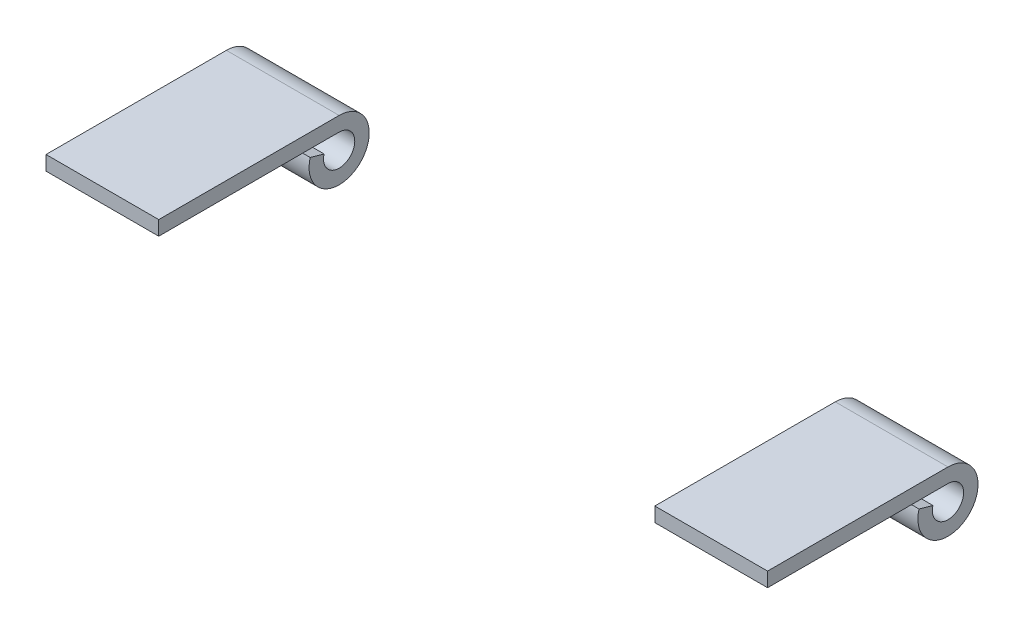
ISO-10303-21;
HEADER;
FILE_DESCRIPTION(('STEP AP214'),'2;1');
FILE_NAME('part.step','',(''),(''),'','','');
FILE_SCHEMA(('AUTOMOTIVE_DESIGN { 1 0 10303 214 1 1 1 1 }'));
ENDSEC;
DATA;
#1=APPLICATION_CONTEXT('core data for automotive mechanical design processes');
#2=APPLICATION_PROTOCOL_DEFINITION('international standard','automotive_design',2000,#1);
#3=PRODUCT_CONTEXT('',#1,'mechanical');
#4=PRODUCT('Part','Part','',(#3));
#5=PRODUCT_RELATED_PRODUCT_CATEGORY('part','',(#4));
#6=PRODUCT_DEFINITION_FORMATION('','',#4);
#7=PRODUCT_DEFINITION_CONTEXT('part definition',#1,'design');
#8=PRODUCT_DEFINITION('design','',#6,#7);
#9=PRODUCT_DEFINITION_SHAPE('','',#8);
#10=(LENGTH_UNIT() NAMED_UNIT(*) SI_UNIT(.MILLI.,.METRE.));
#11=(NAMED_UNIT(*) PLANE_ANGLE_UNIT() SI_UNIT($,.RADIAN.));
#12=(NAMED_UNIT(*) SI_UNIT($,.STERADIAN.) SOLID_ANGLE_UNIT());
#13=UNCERTAINTY_MEASURE_WITH_UNIT(LENGTH_MEASURE(1.E-05),#10,'distance_accuracy_value','');
#14=(GEOMETRIC_REPRESENTATION_CONTEXT(3) GLOBAL_UNCERTAINTY_ASSIGNED_CONTEXT((#13)) GLOBAL_UNIT_ASSIGNED_CONTEXT((#10,
#11,#12)) REPRESENTATION_CONTEXT('',''));
#15=CARTESIAN_POINT('',(0.,0.,0.));
#16=DIRECTION('',(0.,0.,1.));
#17=DIRECTION('',(1.,0.,0.));
#18=AXIS2_PLACEMENT_3D('',#15,#16,#17);
#19=CARTESIAN_POINT('',(-9.14260440613743,-31.4959999999984,0.));
#20=DIRECTION('',(0.,1.,0.));
#21=DIRECTION('',(0.,0.,1.));
#22=AXIS2_PLACEMENT_3D('',#19,#20,#21);
#23=PLANE('',#22);
#24=DIRECTION('',(0.,0.,-1.));
#25=VECTOR('',#24,1.);
#26=CARTESIAN_POINT('',(-104.775,-31.4959999999984,0.));
#27=LINE('',#26,#25);
#28=CARTESIAN_POINT('',(-104.775,-31.4959999999999,-1464.58633761999));
#29=VERTEX_POINT('',#28);
#30=CARTESIAN_POINT('',(-104.775,-31.4959999999999,-1540.78633761999));
#31=VERTEX_POINT('',#30);
#32=EDGE_CURVE('E129',#29,#31,#27,.T.);
#33=ORIENTED_EDGE('',*,*,#32,.F.);
#34=DIRECTION('',(-1.,0.,0.));
#35=VECTOR('',#34,1.);
#36=CARTESIAN_POINT('',(-9.14260440613743,-31.4959999999999,-1464.58633761999));
#37=LINE('',#36,#35);
#38=CARTESIAN_POINT('',(-152.4,-31.4959999999999,-1464.58633761999));
#39=VERTEX_POINT('',#38);
#40=EDGE_CURVE('E50',#29,#39,#37,.T.);
#41=ORIENTED_EDGE('',*,*,#40,.T.);
#42=DIRECTION('',(0.,0.,-1.));
#43=VECTOR('',#42,1.);
#44=CARTESIAN_POINT('',(-152.4,-31.4959999999984,0.));
#45=LINE('',#44,#43);
#46=CARTESIAN_POINT('',(-152.4,-31.4959999999999,-1540.78633761999));
#47=VERTEX_POINT('',#46);
#48=EDGE_CURVE('E135',#39,#47,#45,.T.);
#49=ORIENTED_EDGE('',*,*,#48,.T.);
#50=DIRECTION('',(-1.,0.,0.));
#51=VECTOR('',#50,1.);
#52=CARTESIAN_POINT('',(-9.14260440613743,-31.4959999999999,-1540.78633761999));
#53=LINE('',#52,#51);
#54=EDGE_CURVE('E94',#31,#47,#53,.T.);
#55=ORIENTED_EDGE('',*,*,#54,.F.);
#56=EDGE_LOOP('',(#33,#41,#49,#55));
#57=FACE_BOUND('',#56,.T.);
#58=ADVANCED_FACE('F46',(#57),#23,.F.);
#59=CARTESIAN_POINT('',(-9.14260440613743,-38.1000000000001,-1540.78633761999));
#60=DIRECTION('',(-1.,0.,0.));
#61=DIRECTION('',(0.,0.,1.));
#62=AXIS2_PLACEMENT_3D('',#59,#60,#61);
#63=CYLINDRICAL_SURFACE('',#62,6.60400000000012);
#64=DIRECTION('',(-1.,0.,0.));
#65=VECTOR('',#64,1.);
#66=CARTESIAN_POINT('',(-9.14260440613743,-36.3169200000001,-1534.42760805241));
#67=LINE('',#66,#65);
#68=CARTESIAN_POINT('',(-104.775,-36.3169200000001,-1534.42760805241));
#69=VERTEX_POINT('',#68);
#70=CARTESIAN_POINT('',(-152.4,-36.3169200000001,-1534.42760805241));
#71=VERTEX_POINT('',#70);
#72=EDGE_CURVE('E144',#69,#71,#67,.T.);
#73=ORIENTED_EDGE('',*,*,#72,.F.);
#74=CARTESIAN_POINT('',(-104.775,-38.1000000000001,-1540.78633761999));
#75=DIRECTION('',(1.,0.,0.));
#76=DIRECTION('',(0.,0.,-1.));
#77=AXIS2_PLACEMENT_3D('',#74,#75,#76);
#78=CIRCLE('',#77,6.60400000000012);
#79=EDGE_CURVE('E101',#69,#31,#78,.T.);
#80=ORIENTED_EDGE('',*,*,#79,.T.);
#81=ORIENTED_EDGE('',*,*,#54,.T.);
#82=CARTESIAN_POINT('',(-152.4,-38.1000000000001,-1540.78633761999));
#83=DIRECTION('',(1.,0.,0.));
#84=DIRECTION('',(0.,0.,-1.));
#85=AXIS2_PLACEMENT_3D('',#82,#83,#84);
#86=CIRCLE('',#85,6.60400000000012);
#87=EDGE_CURVE('E141',#71,#47,#86,.T.);
#88=ORIENTED_EDGE('',*,*,#87,.F.);
#89=EDGE_LOOP('',(#73,#80,#81,#88));
#90=FACE_BOUND('',#89,.T.);
#91=ADVANCED_FACE('F172',(#90),#63,.F.);
#92=CARTESIAN_POINT('',(-9.14260440613743,365.239237945725,-102.418379878407));
#93=DIRECTION('',(0.,-0.962860322165154,0.270000000000029));
#94=DIRECTION('',(0.,-0.270000000000029,-0.962860322165154));
#95=AXIS2_PLACEMENT_3D('',#92,#93,#94);
#96=PLANE('',#95);
#97=DIRECTION('',(0.,0.270000000000029,0.962860322165154));
#98=VECTOR('',#97,1.);
#99=CARTESIAN_POINT('',(-104.775,365.239237945725,-102.418379878407));
#100=LINE('',#99,#98);
#101=CARTESIAN_POINT('',(-104.775,-34.6709999999999,-1528.55801152849));
#102=VERTEX_POINT('',#101);
#103=EDGE_CURVE('E123',#69,#102,#100,.T.);
#104=ORIENTED_EDGE('',*,*,#103,.F.);
#105=ORIENTED_EDGE('',*,*,#72,.T.);
#106=DIRECTION('',(0.,0.270000000000029,0.962860322165154));
#107=VECTOR('',#106,1.);
#108=CARTESIAN_POINT('',(-152.4,365.239237945725,-102.418379878407));
#109=LINE('',#108,#107);
#110=CARTESIAN_POINT('',(-152.4,-34.6709999999999,-1528.55801152849));
#111=VERTEX_POINT('',#110);
#112=EDGE_CURVE('E147',#71,#111,#109,.T.);
#113=ORIENTED_EDGE('',*,*,#112,.T.);
#114=DIRECTION('',(-1.,0.,0.));
#115=VECTOR('',#114,1.);
#116=CARTESIAN_POINT('',(-9.14260440613743,-34.6709999999999,-1528.55801152849));
#117=LINE('',#116,#115);
#118=EDGE_CURVE('E148',#102,#111,#117,.T.);
#119=ORIENTED_EDGE('',*,*,#118,.F.);
#120=EDGE_LOOP('',(#104,#105,#113,#119));
#121=FACE_BOUND('',#120,.T.);
#122=ADVANCED_FACE('F174',(#121),#96,.F.);
#123=CARTESIAN_POINT('',(-9.14260440613743,-38.1000000000001,-1540.78633761999));
#124=DIRECTION('',(-1.,0.,0.));
#125=DIRECTION('',(0.,0.,1.));
#126=AXIS2_PLACEMENT_3D('',#123,#124,#125);
#127=CYLINDRICAL_SURFACE('',#126,12.7);
#128=CARTESIAN_POINT('',(-104.775,-38.1000000000001,-1540.78633761999));
#129=DIRECTION('',(1.,0.,0.));
#130=DIRECTION('',(0.,0.,-1.));
#131=AXIS2_PLACEMENT_3D('',#128,#129,#130);
#132=CIRCLE('',#131,12.7);
#133=CARTESIAN_POINT('',(-104.775,-25.4000000000001,-1540.78633761999));
#134=VERTEX_POINT('',#133);
#135=EDGE_CURVE('E56',#102,#134,#132,.T.);
#136=ORIENTED_EDGE('',*,*,#135,.F.);
#137=ORIENTED_EDGE('',*,*,#118,.T.);
#138=CARTESIAN_POINT('',(-152.4,-38.1000000000001,-1540.78633761999));
#139=DIRECTION('',(1.,0.,0.));
#140=DIRECTION('',(0.,0.,-1.));
#141=AXIS2_PLACEMENT_3D('',#138,#139,#140);
#142=CIRCLE('',#141,12.7);
#143=CARTESIAN_POINT('',(-152.4,-25.4000000000001,-1540.78633761999));
#144=VERTEX_POINT('',#143);
#145=EDGE_CURVE('E117',#111,#144,#142,.T.);
#146=ORIENTED_EDGE('',*,*,#145,.T.);
#147=DIRECTION('',(-1.,0.,0.));
#148=VECTOR('',#147,1.);
#149=CARTESIAN_POINT('',(-9.14260440613743,-25.4000000000001,-1540.78633761999));
#150=LINE('',#149,#148);
#151=EDGE_CURVE('E108',#134,#144,#150,.T.);
#152=ORIENTED_EDGE('',*,*,#151,.F.);
#153=EDGE_LOOP('',(#136,#137,#146,#152));
#154=FACE_BOUND('',#153,.T.);
#155=ADVANCED_FACE('F114',(#154),#127,.T.);
#156=CARTESIAN_POINT('',(-9.14260440613743,-25.3999999999992,0.));
#157=DIRECTION('',(0.,-1.,0.));
#158=DIRECTION('',(0.,0.,-1.));
#159=AXIS2_PLACEMENT_3D('',#156,#157,#158);
#160=PLANE('',#159);
#161=DIRECTION('',(0.,0.,1.));
#162=VECTOR('',#161,1.);
#163=CARTESIAN_POINT('',(-104.775,-25.3999999999992,0.));
#164=LINE('',#163,#162);
#165=CARTESIAN_POINT('',(-104.775,-25.4,-1464.58633761999));
#166=VERTEX_POINT('',#165);
#167=EDGE_CURVE('E12',#134,#166,#164,.T.);
#168=ORIENTED_EDGE('',*,*,#167,.F.);
#169=ORIENTED_EDGE('',*,*,#151,.T.);
#170=DIRECTION('',(0.,0.,1.));
#171=VECTOR('',#170,1.);
#172=CARTESIAN_POINT('',(-152.4,-25.3999999999992,0.));
#173=LINE('',#172,#171);
#174=CARTESIAN_POINT('',(-152.4,-25.4,-1464.58633761999));
#175=VERTEX_POINT('',#174);
#176=EDGE_CURVE('E120',#144,#175,#173,.T.);
#177=ORIENTED_EDGE('',*,*,#176,.T.);
#178=DIRECTION('',(-1.,0.,0.));
#179=VECTOR('',#178,1.);
#180=CARTESIAN_POINT('',(-9.14260440613743,-25.4,-1464.58633761999));
#181=LINE('',#180,#179);
#182=EDGE_CURVE('E69',#166,#175,#181,.T.);
#183=ORIENTED_EDGE('',*,*,#182,.F.);
#184=EDGE_LOOP('',(#168,#169,#177,#183));
#185=FACE_BOUND('',#184,.T.);
#186=ADVANCED_FACE('F107',(#185),#160,.F.);
#187=CARTESIAN_POINT('',(-9.14260440613743,0.,-1464.58633761999));
#188=DIRECTION('',(0.,0.,-1.));
#189=DIRECTION('',(-1.,0.,0.));
#190=AXIS2_PLACEMENT_3D('',#187,#188,#189);
#191=PLANE('',#190);
#192=DIRECTION('',(0.,-1.,0.));
#193=VECTOR('',#192,1.);
#194=CARTESIAN_POINT('',(-104.775,0.,-1464.58633761999));
#195=LINE('',#194,#193);
#196=EDGE_CURVE('E139',#166,#29,#195,.T.);
#197=ORIENTED_EDGE('',*,*,#196,.F.);
#198=ORIENTED_EDGE('',*,*,#182,.T.);
#199=DIRECTION('',(0.,-1.,0.));
#200=VECTOR('',#199,1.);
#201=CARTESIAN_POINT('',(-152.4,0.,-1464.58633761999));
#202=LINE('',#201,#200);
#203=EDGE_CURVE('E151',#175,#39,#202,.T.);
#204=ORIENTED_EDGE('',*,*,#203,.T.);
#205=ORIENTED_EDGE('',*,*,#40,.F.);
#206=EDGE_LOOP('',(#197,#198,#204,#205));
#207=FACE_BOUND('',#206,.T.);
#208=ADVANCED_FACE('F168',(#207),#191,.F.);
#209=CARTESIAN_POINT('',(-152.4,-38.1000000000001,-1540.78633761999));
#210=DIRECTION('',(1.,0.,0.));
#211=DIRECTION('',(0.,0.,-1.));
#212=AXIS2_PLACEMENT_3D('',#209,#210,#211);
#213=PLANE('',#212);
#214=ORIENTED_EDGE('',*,*,#48,.F.);
#215=ORIENTED_EDGE('',*,*,#203,.F.);
#216=ORIENTED_EDGE('',*,*,#176,.F.);
#217=ORIENTED_EDGE('',*,*,#145,.F.);
#218=ORIENTED_EDGE('',*,*,#112,.F.);
#219=ORIENTED_EDGE('',*,*,#87,.T.);
#220=EDGE_LOOP('',(#214,#215,#216,#217,#218,#219));
#221=FACE_BOUND('',#220,.T.);
#222=ADVANCED_FACE('F170',(#221),#213,.F.);
#223=CARTESIAN_POINT('',(-104.775,-38.1000000000001,-1540.78633761999));
#224=DIRECTION('',(1.,0.,0.));
#225=DIRECTION('',(0.,0.,-1.));
#226=AXIS2_PLACEMENT_3D('',#223,#224,#225);
#227=PLANE('',#226);
#228=ORIENTED_EDGE('',*,*,#196,.T.);
#229=ORIENTED_EDGE('',*,*,#32,.T.);
#230=ORIENTED_EDGE('',*,*,#79,.F.);
#231=ORIENTED_EDGE('',*,*,#103,.T.);
#232=ORIENTED_EDGE('',*,*,#135,.T.);
#233=ORIENTED_EDGE('',*,*,#167,.T.);
#234=EDGE_LOOP('',(#228,#229,#230,#231,#232,#233));
#235=FACE_BOUND('',#234,.T.);
#236=ADVANCED_FACE('F48',(#235),#227,.T.);
#237=CLOSED_SHELL('',(#58,#91,#122,#155,#186,#208,#222,#236));
#238=MANIFOLD_SOLID_BREP('B2',#237);
#239=CARTESIAN_POINT('',(9.14260440613743,-25.3999999999992,0.));
#240=DIRECTION('',(0.,-1.,0.));
#241=DIRECTION('',(0.,0.,-1.));
#242=AXIS2_PLACEMENT_3D('',#239,#240,#241);
#243=PLANE('',#242);
#244=DIRECTION('',(0.,0.,-1.));
#245=VECTOR('',#244,1.);
#246=CARTESIAN_POINT('',(104.775,-25.3999999999992,0.));
#247=LINE('',#246,#245);
#248=CARTESIAN_POINT('',(104.775,-25.4,-1464.58633761999));
#249=VERTEX_POINT('',#248);
#250=CARTESIAN_POINT('',(104.775,-25.4000000000001,-1540.78633761999));
#251=VERTEX_POINT('',#250);
#252=EDGE_CURVE('E330',#249,#251,#247,.T.);
#253=ORIENTED_EDGE('',*,*,#252,.F.);
#254=DIRECTION('',(1.,0.,0.));
#255=VECTOR('',#254,1.);
#256=CARTESIAN_POINT('',(9.14260440613743,-25.4,-1464.58633761999));
#257=LINE('',#256,#255);
#258=CARTESIAN_POINT('',(152.4,-25.4,-1464.58633761999));
#259=VERTEX_POINT('',#258);
#260=EDGE_CURVE('E251',#249,#259,#257,.T.);
#261=ORIENTED_EDGE('',*,*,#260,.T.);
#262=DIRECTION('',(0.,0.,-1.));
#263=VECTOR('',#262,1.);
#264=CARTESIAN_POINT('',(152.4,-25.3999999999992,0.));
#265=LINE('',#264,#263);
#266=CARTESIAN_POINT('',(152.4,-25.4000000000001,-1540.78633761999));
#267=VERTEX_POINT('',#266);
#268=EDGE_CURVE('E336',#259,#267,#265,.T.);
#269=ORIENTED_EDGE('',*,*,#268,.T.);
#270=DIRECTION('',(1.,0.,0.));
#271=VECTOR('',#270,1.);
#272=CARTESIAN_POINT('',(9.14260440613743,-25.4000000000001,-1540.78633761999));
#273=LINE('',#272,#271);
#274=EDGE_CURVE('E295',#251,#267,#273,.T.);
#275=ORIENTED_EDGE('',*,*,#274,.F.);
#276=EDGE_LOOP('',(#253,#261,#269,#275));
#277=FACE_BOUND('',#276,.T.);
#278=ADVANCED_FACE('F247',(#277),#243,.F.);
#279=CARTESIAN_POINT('',(9.14260440613743,-38.1000000000001,-1540.78633761999));
#280=DIRECTION('',(1.,0.,0.));
#281=DIRECTION('',(0.,0.,-1.));
#282=AXIS2_PLACEMENT_3D('',#279,#280,#281);
#283=CYLINDRICAL_SURFACE('',#282,12.7);
#284=DIRECTION('',(1.,0.,0.));
#285=VECTOR('',#284,1.);
#286=CARTESIAN_POINT('',(9.14260440613743,-34.671,-1528.55801152849));
#287=LINE('',#286,#285);
#288=CARTESIAN_POINT('',(104.775,-34.671,-1528.55801152849));
#289=VERTEX_POINT('',#288);
#290=CARTESIAN_POINT('',(152.4,-34.671,-1528.55801152849));
#291=VERTEX_POINT('',#290);
#292=EDGE_CURVE('E345',#289,#291,#287,.T.);
#293=ORIENTED_EDGE('',*,*,#292,.F.);
#294=CARTESIAN_POINT('',(104.775,-38.1000000000001,-1540.78633761999));
#295=DIRECTION('',(-1.,0.,0.));
#296=DIRECTION('',(0.,0.,1.));
#297=AXIS2_PLACEMENT_3D('',#294,#295,#296);
#298=CIRCLE('',#297,12.7);
#299=EDGE_CURVE('E302',#289,#251,#298,.F.);
#300=ORIENTED_EDGE('',*,*,#299,.T.);
#301=ORIENTED_EDGE('',*,*,#274,.T.);
#302=CARTESIAN_POINT('',(152.4,-38.1000000000001,-1540.78633761999));
#303=DIRECTION('',(1.,0.,0.));
#304=DIRECTION('',(0.,0.,-1.));
#305=AXIS2_PLACEMENT_3D('',#302,#303,#304);
#306=CIRCLE('',#305,12.7);
#307=EDGE_CURVE('E342',#291,#267,#306,.T.);
#308=ORIENTED_EDGE('',*,*,#307,.F.);
#309=EDGE_LOOP('',(#293,#300,#301,#308));
#310=FACE_BOUND('',#309,.T.);
#311=ADVANCED_FACE('F373',(#310),#283,.T.);
#312=CARTESIAN_POINT('',(9.14260440613743,365.239237945725,-102.418379878407));
#313=DIRECTION('',(0.,-0.962860322165154,0.270000000000029));
#314=DIRECTION('',(0.,-0.270000000000029,-0.962860322165154));
#315=AXIS2_PLACEMENT_3D('',#312,#313,#314);
#316=PLANE('',#315);
#317=DIRECTION('',(0.,-0.270000000000029,-0.962860322165154));
#318=VECTOR('',#317,1.);
#319=CARTESIAN_POINT('',(104.775,365.239237945725,-102.418379878407));
#320=LINE('',#319,#318);
#321=CARTESIAN_POINT('',(104.775,-36.3169200000001,-1534.42760805241));
#322=VERTEX_POINT('',#321);
#323=EDGE_CURVE('E324',#289,#322,#320,.T.);
#324=ORIENTED_EDGE('',*,*,#323,.F.);
#325=ORIENTED_EDGE('',*,*,#292,.T.);
#326=DIRECTION('',(0.,-0.270000000000029,-0.962860322165154));
#327=VECTOR('',#326,1.);
#328=CARTESIAN_POINT('',(152.4,365.239237945725,-102.418379878407));
#329=LINE('',#328,#327);
#330=CARTESIAN_POINT('',(152.4,-36.3169200000001,-1534.42760805241));
#331=VERTEX_POINT('',#330);
#332=EDGE_CURVE('E348',#291,#331,#329,.T.);
#333=ORIENTED_EDGE('',*,*,#332,.T.);
#334=DIRECTION('',(1.,0.,0.));
#335=VECTOR('',#334,1.);
#336=CARTESIAN_POINT('',(9.14260440613743,-36.3169200000001,-1534.42760805241));
#337=LINE('',#336,#335);
#338=EDGE_CURVE('E349',#322,#331,#337,.T.);
#339=ORIENTED_EDGE('',*,*,#338,.F.);
#340=EDGE_LOOP('',(#324,#325,#333,#339));
#341=FACE_BOUND('',#340,.T.);
#342=ADVANCED_FACE('F375',(#341),#316,.F.);
#343=CARTESIAN_POINT('',(9.14260440613743,-38.1000000000001,-1540.78633761999));
#344=DIRECTION('',(1.,0.,0.));
#345=DIRECTION('',(0.,0.,-1.));
#346=AXIS2_PLACEMENT_3D('',#343,#344,#345);
#347=CYLINDRICAL_SURFACE('',#346,6.60400000000012);
#348=CARTESIAN_POINT('',(104.775,-38.1000000000001,-1540.78633761999));
#349=DIRECTION('',(-1.,0.,0.));
#350=DIRECTION('',(0.,0.,1.));
#351=AXIS2_PLACEMENT_3D('',#348,#349,#350);
#352=CIRCLE('',#351,6.60400000000012);
#353=CARTESIAN_POINT('',(104.775,-31.496,-1540.78633761999));
#354=VERTEX_POINT('',#353);
#355=EDGE_CURVE('E257',#322,#354,#352,.F.);
#356=ORIENTED_EDGE('',*,*,#355,.F.);
#357=ORIENTED_EDGE('',*,*,#338,.T.);
#358=CARTESIAN_POINT('',(152.4,-38.1000000000001,-1540.78633761999));
#359=DIRECTION('',(1.,0.,0.));
#360=DIRECTION('',(0.,0.,-1.));
#361=AXIS2_PLACEMENT_3D('',#358,#359,#360);
#362=CIRCLE('',#361,6.60400000000012);
#363=CARTESIAN_POINT('',(152.4,-31.496,-1540.78633761999));
#364=VERTEX_POINT('',#363);
#365=EDGE_CURVE('E318',#331,#364,#362,.T.);
#366=ORIENTED_EDGE('',*,*,#365,.T.);
#367=DIRECTION('',(1.,0.,0.));
#368=VECTOR('',#367,1.);
#369=CARTESIAN_POINT('',(9.14260440613743,-31.496,-1540.78633761999));
#370=LINE('',#369,#368);
#371=EDGE_CURVE('E309',#354,#364,#370,.T.);
#372=ORIENTED_EDGE('',*,*,#371,.F.);
#373=EDGE_LOOP('',(#356,#357,#366,#372));
#374=FACE_BOUND('',#373,.T.);
#375=ADVANCED_FACE('F315',(#374),#347,.F.);
#376=CARTESIAN_POINT('',(9.14260440613743,-31.4959999999984,0.));
#377=DIRECTION('',(0.,1.,0.));
#378=DIRECTION('',(0.,0.,1.));
#379=AXIS2_PLACEMENT_3D('',#376,#377,#378);
#380=PLANE('',#379);
#381=DIRECTION('',(0.,0.,1.));
#382=VECTOR('',#381,1.);
#383=CARTESIAN_POINT('',(104.775,-31.4959999999984,0.));
#384=LINE('',#383,#382);
#385=CARTESIAN_POINT('',(104.775,-31.4959999999999,-1464.58633761999));
#386=VERTEX_POINT('',#385);
#387=EDGE_CURVE('E44',#354,#386,#384,.T.);
#388=ORIENTED_EDGE('',*,*,#387,.F.);
#389=ORIENTED_EDGE('',*,*,#371,.T.);
#390=DIRECTION('',(0.,0.,1.));
#391=VECTOR('',#390,1.);
#392=CARTESIAN_POINT('',(152.4,-31.4959999999984,0.));
#393=LINE('',#392,#391);
#394=CARTESIAN_POINT('',(152.4,-31.4959999999999,-1464.58633761999));
#395=VERTEX_POINT('',#394);
#396=EDGE_CURVE('E321',#364,#395,#393,.T.);
#397=ORIENTED_EDGE('',*,*,#396,.T.);
#398=DIRECTION('',(1.,0.,0.));
#399=VECTOR('',#398,1.);
#400=CARTESIAN_POINT('',(9.14260440613743,-31.4959999999999,-1464.58633761999));
#401=LINE('',#400,#399);
#402=EDGE_CURVE('E270',#386,#395,#401,.T.);
#403=ORIENTED_EDGE('',*,*,#402,.F.);
#404=EDGE_LOOP('',(#388,#389,#397,#403));
#405=FACE_BOUND('',#404,.T.);
#406=ADVANCED_FACE('F308',(#405),#380,.F.);
#407=CARTESIAN_POINT('',(9.14260440613743,0.,-1464.58633761999));
#408=DIRECTION('',(0.,0.,-1.));
#409=DIRECTION('',(-1.,0.,0.));
#410=AXIS2_PLACEMENT_3D('',#407,#408,#409);
#411=PLANE('',#410);
#412=DIRECTION('',(0.,1.,0.));
#413=VECTOR('',#412,1.);
#414=CARTESIAN_POINT('',(104.775,0.,-1464.58633761999));
#415=LINE('',#414,#413);
#416=EDGE_CURVE('E340',#386,#249,#415,.T.);
#417=ORIENTED_EDGE('',*,*,#416,.F.);
#418=ORIENTED_EDGE('',*,*,#402,.T.);
#419=DIRECTION('',(0.,1.,0.));
#420=VECTOR('',#419,1.);
#421=CARTESIAN_POINT('',(152.4,0.,-1464.58633761999));
#422=LINE('',#421,#420);
#423=EDGE_CURVE('E352',#395,#259,#422,.T.);
#424=ORIENTED_EDGE('',*,*,#423,.T.);
#425=ORIENTED_EDGE('',*,*,#260,.F.);
#426=EDGE_LOOP('',(#417,#418,#424,#425));
#427=FACE_BOUND('',#426,.T.);
#428=ADVANCED_FACE('F369',(#427),#411,.F.);
#429=CARTESIAN_POINT('',(152.4,-38.1000000000001,-1540.78633761999));
#430=DIRECTION('',(1.,0.,0.));
#431=DIRECTION('',(0.,0.,-1.));
#432=AXIS2_PLACEMENT_3D('',#429,#430,#431);
#433=PLANE('',#432);
#434=ORIENTED_EDGE('',*,*,#268,.F.);
#435=ORIENTED_EDGE('',*,*,#423,.F.);
#436=ORIENTED_EDGE('',*,*,#396,.F.);
#437=ORIENTED_EDGE('',*,*,#365,.F.);
#438=ORIENTED_EDGE('',*,*,#332,.F.);
#439=ORIENTED_EDGE('',*,*,#307,.T.);
#440=EDGE_LOOP('',(#434,#435,#436,#437,#438,#439));
#441=FACE_BOUND('',#440,.T.);
#442=ADVANCED_FACE('F371',(#441),#433,.T.);
#443=CARTESIAN_POINT('',(104.775,-38.1000000000001,-1540.78633761999));
#444=DIRECTION('',(-1.,0.,0.));
#445=DIRECTION('',(0.,0.,1.));
#446=AXIS2_PLACEMENT_3D('',#443,#444,#445);
#447=PLANE('',#446);
#448=ORIENTED_EDGE('',*,*,#416,.T.);
#449=ORIENTED_EDGE('',*,*,#252,.T.);
#450=ORIENTED_EDGE('',*,*,#299,.F.);
#451=ORIENTED_EDGE('',*,*,#323,.T.);
#452=ORIENTED_EDGE('',*,*,#355,.T.);
#453=ORIENTED_EDGE('',*,*,#387,.T.);
#454=EDGE_LOOP('',(#448,#449,#450,#451,#452,#453));
#455=FACE_BOUND('',#454,.T.);
#456=ADVANCED_FACE('F249',(#455),#447,.T.);
#457=CLOSED_SHELL('',(#278,#311,#342,#375,#406,#428,#442,#456));
#458=MANIFOLD_SOLID_BREP('B6',#457);
#459=ADVANCED_BREP_SHAPE_REPRESENTATION('',(#18,#238,#458),#14);
#460=SHAPE_DEFINITION_REPRESENTATION(#9,#459);
ENDSEC;
END-ISO-10303-21;
